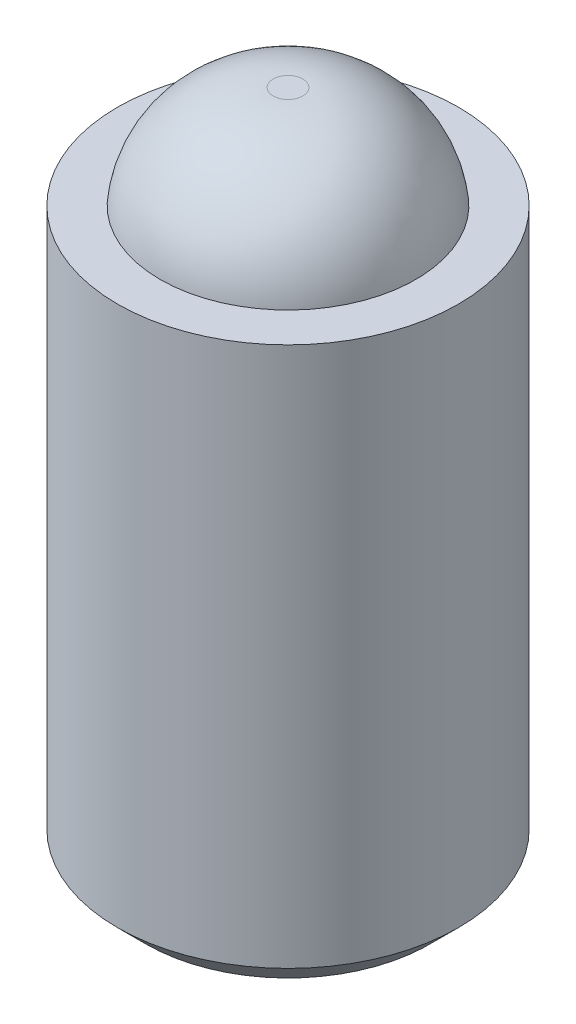
ISO-10303-21;
HEADER;
FILE_DESCRIPTION(('STEP AP214'),'2;1');
FILE_NAME('part.step','',(''),(''),'','','');
FILE_SCHEMA(('AUTOMOTIVE_DESIGN { 1 0 10303 214 1 1 1 1 }'));
ENDSEC;
DATA;
#1=APPLICATION_CONTEXT('core data for automotive mechanical design processes');
#2=APPLICATION_PROTOCOL_DEFINITION('international standard','automotive_design',2000,#1);
#3=PRODUCT_CONTEXT('',#1,'mechanical');
#4=PRODUCT('Part','Part','',(#3));
#5=PRODUCT_RELATED_PRODUCT_CATEGORY('part','',(#4));
#6=PRODUCT_DEFINITION_FORMATION('','',#4);
#7=PRODUCT_DEFINITION_CONTEXT('part definition',#1,'design');
#8=PRODUCT_DEFINITION('design','',#6,#7);
#9=PRODUCT_DEFINITION_SHAPE('','',#8);
#10=(LENGTH_UNIT() NAMED_UNIT(*) SI_UNIT(.MILLI.,.METRE.));
#11=(NAMED_UNIT(*) PLANE_ANGLE_UNIT() SI_UNIT($,.RADIAN.));
#12=(NAMED_UNIT(*) SI_UNIT($,.STERADIAN.) SOLID_ANGLE_UNIT());
#13=UNCERTAINTY_MEASURE_WITH_UNIT(LENGTH_MEASURE(1.E-05),#10,'distance_accuracy_value','');
#14=(GEOMETRIC_REPRESENTATION_CONTEXT(3) GLOBAL_UNCERTAINTY_ASSIGNED_CONTEXT((#13)) GLOBAL_UNIT_ASSIGNED_CONTEXT((#10,
#11,#12)) REPRESENTATION_CONTEXT('',''));
#15=CARTESIAN_POINT('',(0.,0.,0.));
#16=DIRECTION('',(0.,0.,1.));
#17=DIRECTION('',(1.,0.,0.));
#18=AXIS2_PLACEMENT_3D('',#15,#16,#17);
#19=CARTESIAN_POINT('',(0.,10.,0.));
#20=DIRECTION('',(0.,1.,0.));
#21=DIRECTION('',(0.,0.,1.));
#22=AXIS2_PLACEMENT_3D('',#19,#20,#21);
#23=PLANE('',#22);
#24=CARTESIAN_POINT('',(0.,10.,0.));
#25=DIRECTION('',(0.,1.,0.));
#26=DIRECTION('',(0.,0.,1.));
#27=AXIS2_PLACEMENT_3D('',#24,#25,#26);
#28=CIRCLE('',#27,3.);
#29=CARTESIAN_POINT('',(0.,10.,3.));
#30=VERTEX_POINT('',#29);
#31=EDGE_CURVE('E145',#30,#30,#28,.T.);
#32=ORIENTED_EDGE('',*,*,#31,.T.);
#33=EDGE_LOOP('',(#32));
#34=FACE_BOUND('',#33,.T.);
#35=CARTESIAN_POINT('',(0.,10.,0.));
#36=DIRECTION('',(0.,1.,0.));
#37=DIRECTION('',(0.,0.,1.));
#38=AXIS2_PLACEMENT_3D('',#35,#36,#37);
#39=CIRCLE('',#38,2.25);
#40=CARTESIAN_POINT('',(0.,10.,2.25));
#41=VERTEX_POINT('',#40);
#42=EDGE_CURVE('E137',#41,#41,#39,.T.);
#43=ORIENTED_EDGE('',*,*,#42,.F.);
#44=EDGE_LOOP('',(#43));
#45=FACE_BOUND('',#44,.T.);
#46=ADVANCED_FACE('F35',(#34,#45),#23,.T.);
#47=CARTESIAN_POINT('',(0.,10.,0.));
#48=DIRECTION('',(0.,-1.,0.));
#49=DIRECTION('',(0.,0.,-1.));
#50=AXIS2_PLACEMENT_3D('',#47,#48,#49);
#51=CYLINDRICAL_SURFACE('',#50,3.);
#52=CARTESIAN_POINT('',(0.,0.499999999999999,0.));
#53=DIRECTION('',(0.,1.,0.));
#54=DIRECTION('',(0.,0.,1.));
#55=AXIS2_PLACEMENT_3D('',#52,#53,#54);
#56=CIRCLE('',#55,3.);
#57=CARTESIAN_POINT('',(0.,0.499999999999999,3.));
#58=VERTEX_POINT('',#57);
#59=EDGE_CURVE('E43',#58,#58,#56,.T.);
#60=ORIENTED_EDGE('',*,*,#59,.T.);
#61=EDGE_LOOP('',(#60));
#62=FACE_BOUND('',#61,.T.);
#63=ORIENTED_EDGE('',*,*,#31,.F.);
#64=EDGE_LOOP('',(#63));
#65=FACE_BOUND('',#64,.T.);
#66=ADVANCED_FACE('F153',(#62,#65),#51,.T.);
#67=CARTESIAN_POINT('',(0.,0.,0.));
#68=DIRECTION('',(0.,1.,0.));
#69=DIRECTION('',(0.,0.,1.));
#70=AXIS2_PLACEMENT_3D('',#67,#68,#69);
#71=PLANE('',#70);
#72=DIRECTION('',(-0.866025403784438,0.,-0.500000000000001));
#73=VECTOR('',#72,1.);
#74=CARTESIAN_POINT('',(0.,0.,1.80876901197757));
#75=LINE('',#74,#73);
#76=CARTESIAN_POINT('',(0.,0.,1.80876901197757));
#77=VERTEX_POINT('',#76);
#78=CARTESIAN_POINT('',(-1.56643991395065,0.,0.90438450598878));
#79=VERTEX_POINT('',#78);
#80=EDGE_CURVE('E124',#77,#79,#75,.T.);
#81=ORIENTED_EDGE('',*,*,#80,.F.);
#82=DIRECTION('',(-0.866025403784441,0.,0.499999999999995));
#83=VECTOR('',#82,1.);
#84=CARTESIAN_POINT('',(1.56643991395064,0.,0.904384505988802));
#85=LINE('',#84,#83);
#86=CARTESIAN_POINT('',(1.56643991395064,0.,0.904384505988802));
#87=VERTEX_POINT('',#86);
#88=EDGE_CURVE('E50',#87,#77,#85,.T.);
#89=ORIENTED_EDGE('',*,*,#88,.F.);
#90=DIRECTION('',(0.,0.,1.));
#91=VECTOR('',#90,1.);
#92=CARTESIAN_POINT('',(1.56643991395066,0.,-0.904384505988769));
#93=LINE('',#92,#91);
#94=CARTESIAN_POINT('',(1.56643991395066,0.,-0.904384505988769));
#95=VERTEX_POINT('',#94);
#96=EDGE_CURVE('E133',#95,#87,#93,.T.);
#97=ORIENTED_EDGE('',*,*,#96,.F.);
#98=DIRECTION('',(0.866025403784435,0.,0.500000000000007));
#99=VECTOR('',#98,1.);
#100=CARTESIAN_POINT('',(0.,0.,-1.80876901197757));
#101=LINE('',#100,#99);
#102=CARTESIAN_POINT('',(0.,0.,-1.80876901197757));
#103=VERTEX_POINT('',#102);
#104=EDGE_CURVE('E131',#103,#95,#101,.T.);
#105=ORIENTED_EDGE('',*,*,#104,.F.);
#106=DIRECTION('',(0.866025403784442,0.,-0.499999999999995));
#107=VECTOR('',#106,1.);
#108=CARTESIAN_POINT('',(-1.56643991395065,0.,-0.904384505988791));
#109=LINE('',#108,#107);
#110=CARTESIAN_POINT('',(-1.56643991395065,0.,-0.904384505988791));
#111=VERTEX_POINT('',#110);
#112=EDGE_CURVE('E98',#111,#103,#109,.T.);
#113=ORIENTED_EDGE('',*,*,#112,.F.);
#114=DIRECTION('',(0.,0.,-1.));
#115=VECTOR('',#114,1.);
#116=CARTESIAN_POINT('',(-1.56643991395065,0.,0.90438450598878));
#117=LINE('',#116,#115);
#118=EDGE_CURVE('E127',#79,#111,#117,.T.);
#119=ORIENTED_EDGE('',*,*,#118,.F.);
#120=EDGE_LOOP('',(#81,#89,#97,#105,#113,#119));
#121=FACE_BOUND('',#120,.T.);
#122=CARTESIAN_POINT('',(0.,0.,0.));
#123=DIRECTION('',(0.,1.,0.));
#124=DIRECTION('',(0.,0.,1.));
#125=AXIS2_PLACEMENT_3D('',#122,#123,#124);
#126=CIRCLE('',#125,2.5);
#127=CARTESIAN_POINT('',(0.,0.,2.5));
#128=VERTEX_POINT('',#127);
#129=EDGE_CURVE('E11',#128,#128,#126,.F.);
#130=ORIENTED_EDGE('',*,*,#129,.T.);
#131=EDGE_LOOP('',(#130));
#132=FACE_BOUND('',#131,.T.);
#133=ADVANCED_FACE('F175',(#121,#132),#71,.F.);
#134=CARTESIAN_POINT('',(0.,11.8,0.));
#135=DIRECTION('',(0.,1.,0.));
#136=DIRECTION('',(0.,0.,1.));
#137=AXIS2_PLACEMENT_3D('',#134,#135,#136);
#138=PLANE('',#137);
#139=CARTESIAN_POINT('',(0.,11.8,0.));
#140=DIRECTION('',(0.,1.,0.));
#141=DIRECTION('',(0.,0.,1.));
#142=AXIS2_PLACEMENT_3D('',#139,#140,#141);
#143=CIRCLE('',#142,0.26002512578676);
#144=CARTESIAN_POINT('',(0.,11.8,0.26002512578676));
#145=VERTEX_POINT('',#144);
#146=EDGE_CURVE('E148',#145,#145,#143,.T.);
#147=ORIENTED_EDGE('',*,*,#146,.T.);
#148=EDGE_LOOP('',(#147));
#149=FACE_BOUND('',#148,.T.);
#150=ADVANCED_FACE('F166',(#149),#138,.T.);
#151=CARTESIAN_POINT('',(0.,9.8,0.));
#152=DIRECTION('',(0.,-1.,0.));
#153=DIRECTION('',(0.,0.,-1.));
#154=AXIS2_PLACEMENT_3D('',#151,#152,#153);
#155=DEGENERATE_TOROIDAL_SURFACE('',#154,0.26002512578676,2.,.T.);
#156=ORIENTED_EDGE('',*,*,#42,.T.);
#157=EDGE_LOOP('',(#156));
#158=FACE_BOUND('',#157,.T.);
#159=ORIENTED_EDGE('',*,*,#146,.F.);
#160=EDGE_LOOP('',(#159));
#161=FACE_BOUND('',#160,.T.);
#162=ADVANCED_FACE('F158',(#158,#161),#155,.T.);
#163=CARTESIAN_POINT('',(0.,0.499999999999999,0.));
#164=DIRECTION('',(0.,1.,0.));
#165=DIRECTION('',(0.,0.,1.));
#166=AXIS2_PLACEMENT_3D('',#163,#164,#165);
#167=CONICAL_SURFACE('',#166,3.,0.785398163397449);
#168=ORIENTED_EDGE('',*,*,#129,.F.);
#169=EDGE_LOOP('',(#168));
#170=FACE_BOUND('',#169,.T.);
#171=ORIENTED_EDGE('',*,*,#59,.F.);
#172=EDGE_LOOP('',(#171));
#173=FACE_BOUND('',#172,.T.);
#174=ADVANCED_FACE('F37',(#170,#173),#167,.T.);
#175=CARTESIAN_POINT('',(1.56643991395064,1.8,0.904384505988802));
#176=DIRECTION('',(0.499999999999995,0.,0.866025403784441));
#177=DIRECTION('',(0.866025403784442,0.,-0.499999999999995));
#178=AXIS2_PLACEMENT_3D('',#175,#176,#177);
#179=PLANE('',#178);
#180=ORIENTED_EDGE('',*,*,#88,.T.);
#181=DIRECTION('',(0.,-1.,0.));
#182=VECTOR('',#181,1.);
#183=CARTESIAN_POINT('',(0.,1.8,1.80876901197757));
#184=LINE('',#183,#182);
#185=CARTESIAN_POINT('',(0.,1.8,1.80876901197757));
#186=VERTEX_POINT('',#185);
#187=EDGE_CURVE('E80',#186,#77,#184,.T.);
#188=ORIENTED_EDGE('',*,*,#187,.F.);
#189=DIRECTION('',(-0.866025403784441,0.,0.499999999999995));
#190=VECTOR('',#189,1.);
#191=CARTESIAN_POINT('',(1.56643991395064,1.8,0.904384505988802));
#192=LINE('',#191,#190);
#193=CARTESIAN_POINT('',(1.56643991395064,1.8,0.904384505988802));
#194=VERTEX_POINT('',#193);
#195=EDGE_CURVE('E135',#194,#186,#192,.T.);
#196=ORIENTED_EDGE('',*,*,#195,.F.);
#197=DIRECTION('',(0.,-1.,0.));
#198=VECTOR('',#197,1.);
#199=CARTESIAN_POINT('',(1.56643991395064,1.8,0.904384505988802));
#200=LINE('',#199,#198);
#201=EDGE_CURVE('E58',#194,#87,#200,.T.);
#202=ORIENTED_EDGE('',*,*,#201,.T.);
#203=EDGE_LOOP('',(#180,#188,#196,#202));
#204=FACE_BOUND('',#203,.T.);
#205=ADVANCED_FACE('F157',(#204),#179,.F.);
#206=CARTESIAN_POINT('',(1.56643991395066,1.8,-0.904384505988769));
#207=DIRECTION('',(1.,0.,0.));
#208=DIRECTION('',(0.,0.,-1.));
#209=AXIS2_PLACEMENT_3D('',#206,#207,#208);
#210=PLANE('',#209);
#211=ORIENTED_EDGE('',*,*,#96,.T.);
#212=ORIENTED_EDGE('',*,*,#201,.F.);
#213=DIRECTION('',(0.,0.,1.));
#214=VECTOR('',#213,1.);
#215=CARTESIAN_POINT('',(1.56643991395066,1.8,-0.904384505988769));
#216=LINE('',#215,#214);
#217=CARTESIAN_POINT('',(1.56643991395066,1.8,-0.904384505988769));
#218=VERTEX_POINT('',#217);
#219=EDGE_CURVE('E110',#218,#194,#216,.T.);
#220=ORIENTED_EDGE('',*,*,#219,.F.);
#221=DIRECTION('',(0.,-1.,0.));
#222=VECTOR('',#221,1.);
#223=CARTESIAN_POINT('',(1.56643991395066,1.8,-0.904384505988769));
#224=LINE('',#223,#222);
#225=EDGE_CURVE('E102',#218,#95,#224,.T.);
#226=ORIENTED_EDGE('',*,*,#225,.T.);
#227=EDGE_LOOP('',(#211,#212,#220,#226));
#228=FACE_BOUND('',#227,.T.);
#229=ADVANCED_FACE('F164',(#228),#210,.F.);
#230=CARTESIAN_POINT('',(0.,1.8,-1.80876901197757));
#231=DIRECTION('',(0.500000000000007,0.,-0.866025403784435));
#232=DIRECTION('',(-0.866025403784435,0.,-0.500000000000007));
#233=AXIS2_PLACEMENT_3D('',#230,#231,#232);
#234=PLANE('',#233);
#235=ORIENTED_EDGE('',*,*,#104,.T.);
#236=ORIENTED_EDGE('',*,*,#225,.F.);
#237=DIRECTION('',(0.866025403784435,0.,0.500000000000007));
#238=VECTOR('',#237,1.);
#239=CARTESIAN_POINT('',(0.,1.8,-1.80876901197757));
#240=LINE('',#239,#238);
#241=CARTESIAN_POINT('',(0.,1.8,-1.80876901197757));
#242=VERTEX_POINT('',#241);
#243=EDGE_CURVE('E106',#242,#218,#240,.T.);
#244=ORIENTED_EDGE('',*,*,#243,.F.);
#245=DIRECTION('',(0.,-1.,0.));
#246=VECTOR('',#245,1.);
#247=CARTESIAN_POINT('',(0.,1.8,-1.80876901197757));
#248=LINE('',#247,#246);
#249=EDGE_CURVE('E91',#242,#103,#248,.T.);
#250=ORIENTED_EDGE('',*,*,#249,.T.);
#251=EDGE_LOOP('',(#235,#236,#244,#250));
#252=FACE_BOUND('',#251,.T.);
#253=ADVANCED_FACE('F107',(#252),#234,.F.);
#254=CARTESIAN_POINT('',(-1.56643991395065,1.8,-0.904384505988791));
#255=DIRECTION('',(-0.499999999999995,0.,-0.866025403784442));
#256=DIRECTION('',(-0.866025403784442,0.,0.499999999999995));
#257=AXIS2_PLACEMENT_3D('',#254,#255,#256);
#258=PLANE('',#257);
#259=ORIENTED_EDGE('',*,*,#112,.T.);
#260=ORIENTED_EDGE('',*,*,#249,.F.);
#261=DIRECTION('',(0.866025403784442,0.,-0.499999999999995));
#262=VECTOR('',#261,1.);
#263=CARTESIAN_POINT('',(-1.56643991395065,1.8,-0.904384505988791));
#264=LINE('',#263,#262);
#265=CARTESIAN_POINT('',(-1.56643991395065,1.8,-0.904384505988791));
#266=VERTEX_POINT('',#265);
#267=EDGE_CURVE('E95',#266,#242,#264,.T.);
#268=ORIENTED_EDGE('',*,*,#267,.F.);
#269=DIRECTION('',(0.,-1.,0.));
#270=VECTOR('',#269,1.);
#271=CARTESIAN_POINT('',(-1.56643991395065,1.8,-0.904384505988791));
#272=LINE('',#271,#270);
#273=EDGE_CURVE('E103',#266,#111,#272,.T.);
#274=ORIENTED_EDGE('',*,*,#273,.T.);
#275=EDGE_LOOP('',(#259,#260,#268,#274));
#276=FACE_BOUND('',#275,.T.);
#277=ADVANCED_FACE('F93',(#276),#258,.F.);
#278=CARTESIAN_POINT('',(-1.56643991395065,1.8,0.90438450598878));
#279=DIRECTION('',(-1.,0.,0.));
#280=DIRECTION('',(0.,0.,1.));
#281=AXIS2_PLACEMENT_3D('',#278,#279,#280);
#282=PLANE('',#281);
#283=ORIENTED_EDGE('',*,*,#118,.T.);
#284=ORIENTED_EDGE('',*,*,#273,.F.);
#285=DIRECTION('',(0.,0.,-1.));
#286=VECTOR('',#285,1.);
#287=CARTESIAN_POINT('',(-1.56643991395065,1.8,0.90438450598878));
#288=LINE('',#287,#286);
#289=CARTESIAN_POINT('',(-1.56643991395065,1.8,0.90438450598878));
#290=VERTEX_POINT('',#289);
#291=EDGE_CURVE('E116',#290,#266,#288,.T.);
#292=ORIENTED_EDGE('',*,*,#291,.F.);
#293=DIRECTION('',(0.,-1.,0.));
#294=VECTOR('',#293,1.);
#295=CARTESIAN_POINT('',(-1.56643991395065,1.8,0.90438450598878));
#296=LINE('',#295,#294);
#297=EDGE_CURVE('E140',#290,#79,#296,.T.);
#298=ORIENTED_EDGE('',*,*,#297,.T.);
#299=EDGE_LOOP('',(#283,#284,#292,#298));
#300=FACE_BOUND('',#299,.T.);
#301=ADVANCED_FACE('F203',(#300),#282,.F.);
#302=CARTESIAN_POINT('',(0.,1.8,1.80876901197757));
#303=DIRECTION('',(-0.500000000000001,0.,0.866025403784438));
#304=DIRECTION('',(0.866025403784438,0.,0.500000000000001));
#305=AXIS2_PLACEMENT_3D('',#302,#303,#304);
#306=PLANE('',#305);
#307=ORIENTED_EDGE('',*,*,#80,.T.);
#308=ORIENTED_EDGE('',*,*,#297,.F.);
#309=DIRECTION('',(-0.866025403784438,0.,-0.500000000000001));
#310=VECTOR('',#309,1.);
#311=CARTESIAN_POINT('',(0.,1.8,1.80876901197757));
#312=LINE('',#311,#310);
#313=EDGE_CURVE('E118',#186,#290,#312,.T.);
#314=ORIENTED_EDGE('',*,*,#313,.F.);
#315=ORIENTED_EDGE('',*,*,#187,.T.);
#316=EDGE_LOOP('',(#307,#308,#314,#315));
#317=FACE_BOUND('',#316,.T.);
#318=ADVANCED_FACE('F191',(#317),#306,.F.);
#319=CARTESIAN_POINT('',(0.,1.8,0.));
#320=DIRECTION('',(0.,-1.,0.));
#321=DIRECTION('',(0.,0.,-1.));
#322=AXIS2_PLACEMENT_3D('',#319,#320,#321);
#323=PLANE('',#322);
#324=ORIENTED_EDGE('',*,*,#195,.T.);
#325=ORIENTED_EDGE('',*,*,#313,.T.);
#326=ORIENTED_EDGE('',*,*,#291,.T.);
#327=ORIENTED_EDGE('',*,*,#267,.T.);
#328=ORIENTED_EDGE('',*,*,#243,.T.);
#329=ORIENTED_EDGE('',*,*,#219,.T.);
#330=EDGE_LOOP('',(#324,#325,#326,#327,#328,#329));
#331=FACE_BOUND('',#330,.T.);
#332=ADVANCED_FACE('F113',(#331),#323,.T.);
#333=CLOSED_SHELL('',(#46,#66,#133,#150,#162,#174,#205,#229,#253,#277,#301,#318,#332));
#334=MANIFOLD_SOLID_BREP('B2',#333);
#335=ADVANCED_BREP_SHAPE_REPRESENTATION('',(#18,#334),#14);
#336=SHAPE_DEFINITION_REPRESENTATION(#9,#335);
ENDSEC;
END-ISO-10303-21;
